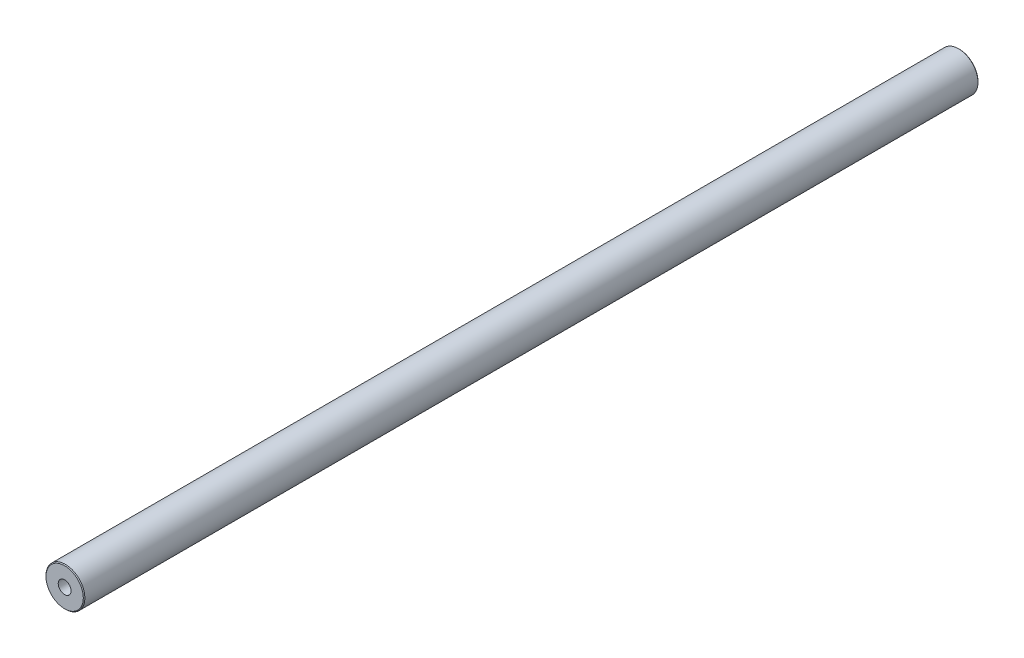
ISO-10303-21;
HEADER;
FILE_DESCRIPTION(('STEP AP214'),'2;1');
FILE_NAME('part.step','',(''),(''),'','','');
FILE_SCHEMA(('AUTOMOTIVE_DESIGN { 1 0 10303 214 1 1 1 1 }'));
ENDSEC;
DATA;
#1=APPLICATION_CONTEXT('core data for automotive mechanical design processes');
#2=APPLICATION_PROTOCOL_DEFINITION('international standard','automotive_design',2000,#1);
#3=PRODUCT_CONTEXT('',#1,'mechanical');
#4=PRODUCT('Part','Part','',(#3));
#5=PRODUCT_RELATED_PRODUCT_CATEGORY('part','',(#4));
#6=PRODUCT_DEFINITION_FORMATION('','',#4);
#7=PRODUCT_DEFINITION_CONTEXT('part definition',#1,'design');
#8=PRODUCT_DEFINITION('design','',#6,#7);
#9=PRODUCT_DEFINITION_SHAPE('','',#8);
#10=(LENGTH_UNIT() NAMED_UNIT(*) SI_UNIT(.MILLI.,.METRE.));
#11=(NAMED_UNIT(*) PLANE_ANGLE_UNIT() SI_UNIT($,.RADIAN.));
#12=(NAMED_UNIT(*) SI_UNIT($,.STERADIAN.) SOLID_ANGLE_UNIT());
#13=UNCERTAINTY_MEASURE_WITH_UNIT(LENGTH_MEASURE(1.E-05),#10,'distance_accuracy_value','');
#14=(GEOMETRIC_REPRESENTATION_CONTEXT(3) GLOBAL_UNCERTAINTY_ASSIGNED_CONTEXT((#13)) GLOBAL_UNIT_ASSIGNED_CONTEXT((#10,
#11,#12)) REPRESENTATION_CONTEXT('',''));
#15=CARTESIAN_POINT('',(0.,0.,0.));
#16=DIRECTION('',(0.,0.,1.));
#17=DIRECTION('',(1.,0.,0.));
#18=AXIS2_PLACEMENT_3D('',#15,#16,#17);
#19=CARTESIAN_POINT('',(0.,0.,115.));
#20=DIRECTION('',(0.,0.,-1.));
#21=DIRECTION('',(-1.,0.,0.));
#22=AXIS2_PLACEMENT_3D('',#19,#20,#21);
#23=CYLINDRICAL_SURFACE('',#22,5.);
#24=CARTESIAN_POINT('',(0.,0.,-114.8));
#25=DIRECTION('',(0.,0.,1.));
#26=DIRECTION('',(1.,0.,0.));
#27=AXIS2_PLACEMENT_3D('',#24,#25,#26);
#28=CIRCLE('',#27,5.);
#29=CARTESIAN_POINT('',(5.,0.,-114.8));
#30=VERTEX_POINT('',#29);
#31=EDGE_CURVE('E91',#30,#30,#28,.T.);
#32=ORIENTED_EDGE('',*,*,#31,.T.);
#33=EDGE_LOOP('',(#32));
#34=FACE_BOUND('',#33,.T.);
#35=CARTESIAN_POINT('',(0.,0.,114.8));
#36=DIRECTION('',(0.,0.,1.));
#37=DIRECTION('',(1.,0.,0.));
#38=AXIS2_PLACEMENT_3D('',#35,#36,#37);
#39=CIRCLE('',#38,5.);
#40=CARTESIAN_POINT('',(5.,0.,114.8));
#41=VERTEX_POINT('',#40);
#42=EDGE_CURVE('E87',#41,#41,#39,.F.);
#43=ORIENTED_EDGE('',*,*,#42,.T.);
#44=EDGE_LOOP('',(#43));
#45=FACE_BOUND('',#44,.T.);
#46=ADVANCED_FACE('F46',(#34,#45),#23,.T.);
#47=CARTESIAN_POINT('',(0.,0.,115.));
#48=DIRECTION('',(0.,0.,1.));
#49=DIRECTION('',(1.,0.,0.));
#50=AXIS2_PLACEMENT_3D('',#47,#48,#49);
#51=PLANE('',#50);
#52=CARTESIAN_POINT('',(0.,0.,115.));
#53=DIRECTION('',(0.,0.,1.));
#54=DIRECTION('',(1.,0.,0.));
#55=AXIS2_PLACEMENT_3D('',#52,#53,#54);
#56=CIRCLE('',#55,4.80000000000003);
#57=CARTESIAN_POINT('',(4.80000000000003,0.,115.));
#58=VERTEX_POINT('',#57);
#59=EDGE_CURVE('E11',#58,#58,#56,.T.);
#60=ORIENTED_EDGE('',*,*,#59,.T.);
#61=EDGE_LOOP('',(#60));
#62=FACE_BOUND('',#61,.T.);
#63=CARTESIAN_POINT('',(0.,0.,115.));
#64=DIRECTION('',(0.,0.,1.));
#65=DIRECTION('',(1.,0.,0.));
#66=AXIS2_PLACEMENT_3D('',#63,#64,#65);
#67=CIRCLE('',#66,1.65);
#68=CARTESIAN_POINT('',(1.65,0.,115.));
#69=VERTEX_POINT('',#68);
#70=EDGE_CURVE('E72',#69,#69,#67,.T.);
#71=ORIENTED_EDGE('',*,*,#70,.F.);
#72=EDGE_LOOP('',(#71));
#73=FACE_BOUND('',#72,.T.);
#74=ADVANCED_FACE('F109',(#62,#73),#51,.T.);
#75=CARTESIAN_POINT('',(0.,0.,-115.));
#76=DIRECTION('',(0.,0.,1.));
#77=DIRECTION('',(1.,0.,0.));
#78=AXIS2_PLACEMENT_3D('',#75,#76,#77);
#79=PLANE('',#78);
#80=CARTESIAN_POINT('',(0.,0.,-115.));
#81=DIRECTION('',(0.,0.,1.));
#82=DIRECTION('',(1.,0.,0.));
#83=AXIS2_PLACEMENT_3D('',#80,#81,#82);
#84=CIRCLE('',#83,4.80000000000003);
#85=CARTESIAN_POINT('',(4.80000000000003,0.,-115.));
#86=VERTEX_POINT('',#85);
#87=EDGE_CURVE('E55',#86,#86,#84,.F.);
#88=ORIENTED_EDGE('',*,*,#87,.T.);
#89=EDGE_LOOP('',(#88));
#90=FACE_BOUND('',#89,.T.);
#91=CARTESIAN_POINT('',(0.,0.,-115.));
#92=DIRECTION('',(0.,0.,-1.));
#93=DIRECTION('',(-1.,0.,0.));
#94=AXIS2_PLACEMENT_3D('',#91,#92,#93);
#95=CIRCLE('',#94,1.65);
#96=CARTESIAN_POINT('',(-1.65,0.,-115.));
#97=VERTEX_POINT('',#96);
#98=EDGE_CURVE('E73',#97,#97,#95,.T.);
#99=ORIENTED_EDGE('',*,*,#98,.F.);
#100=EDGE_LOOP('',(#99));
#101=FACE_BOUND('',#100,.T.);
#102=ADVANCED_FACE('F99',(#90,#101),#79,.F.);
#103=CARTESIAN_POINT('',(0.,0.,103.5));
#104=DIRECTION('',(0.,0.,1.));
#105=DIRECTION('',(1.,0.,0.));
#106=AXIS2_PLACEMENT_3D('',#103,#104,#105);
#107=CONICAL_SURFACE('',#106,1.65,1.02974425867665);
#108=CARTESIAN_POINT('',(0.,0.,102.508579978605));
#109=VERTEX_POINT('',#108);
#110=VERTEX_LOOP('',#109);
#111=FACE_BOUND('',#110,.T.);
#112=CARTESIAN_POINT('',(0.,0.,103.5));
#113=DIRECTION('',(0.,0.,1.));
#114=DIRECTION('',(1.,0.,0.));
#115=AXIS2_PLACEMENT_3D('',#112,#113,#114);
#116=CIRCLE('',#115,1.65);
#117=CARTESIAN_POINT('',(1.65,0.,103.5));
#118=VERTEX_POINT('',#117);
#119=EDGE_CURVE('E79',#118,#118,#116,.T.);
#120=ORIENTED_EDGE('',*,*,#119,.T.);
#121=EDGE_LOOP('',(#120));
#122=FACE_BOUND('',#121,.T.);
#123=ADVANCED_FACE('F123',(#111,#122),#107,.F.);
#124=CARTESIAN_POINT('',(0.,0.,115.));
#125=DIRECTION('',(0.,0.,1.));
#126=DIRECTION('',(1.,0.,0.));
#127=AXIS2_PLACEMENT_3D('',#124,#125,#126);
#128=CYLINDRICAL_SURFACE('',#127,1.65);
#129=ORIENTED_EDGE('',*,*,#119,.F.);
#130=EDGE_LOOP('',(#129));
#131=FACE_BOUND('',#130,.T.);
#132=ORIENTED_EDGE('',*,*,#70,.T.);
#133=EDGE_LOOP('',(#132));
#134=FACE_BOUND('',#133,.T.);
#135=ADVANCED_FACE('F65',(#131,#134),#128,.F.);
#136=CARTESIAN_POINT('',(0.,0.,-103.5));
#137=DIRECTION('',(0.,0.,-1.));
#138=DIRECTION('',(-1.,0.,0.));
#139=AXIS2_PLACEMENT_3D('',#136,#137,#138);
#140=CONICAL_SURFACE('',#139,1.65,1.02974425867665);
#141=CARTESIAN_POINT('',(0.,0.,-102.508579978605));
#142=VERTEX_POINT('',#141);
#143=VERTEX_LOOP('',#142);
#144=FACE_BOUND('',#143,.T.);
#145=CARTESIAN_POINT('',(0.,0.,-103.5));
#146=DIRECTION('',(0.,0.,-1.));
#147=DIRECTION('',(-1.,0.,0.));
#148=AXIS2_PLACEMENT_3D('',#145,#146,#147);
#149=CIRCLE('',#148,1.65);
#150=CARTESIAN_POINT('',(-1.65,0.,-103.5));
#151=VERTEX_POINT('',#150);
#152=EDGE_CURVE('E69',#151,#151,#149,.T.);
#153=ORIENTED_EDGE('',*,*,#152,.T.);
#154=EDGE_LOOP('',(#153));
#155=FACE_BOUND('',#154,.T.);
#156=ADVANCED_FACE('F61',(#144,#155),#140,.F.);
#157=CARTESIAN_POINT('',(0.,0.,-115.));
#158=DIRECTION('',(0.,0.,-1.));
#159=DIRECTION('',(-1.,0.,0.));
#160=AXIS2_PLACEMENT_3D('',#157,#158,#159);
#161=CYLINDRICAL_SURFACE('',#160,1.65);
#162=ORIENTED_EDGE('',*,*,#152,.F.);
#163=EDGE_LOOP('',(#162));
#164=FACE_BOUND('',#163,.T.);
#165=ORIENTED_EDGE('',*,*,#98,.T.);
#166=EDGE_LOOP('',(#165));
#167=FACE_BOUND('',#166,.T.);
#168=ADVANCED_FACE('F64',(#164,#167),#161,.F.);
#169=CARTESIAN_POINT('',(0.,0.,-114.8));
#170=DIRECTION('',(0.,0.,1.));
#171=DIRECTION('',(1.,0.,0.));
#172=AXIS2_PLACEMENT_3D('',#169,#170,#171);
#173=CONICAL_SURFACE('',#172,5.,0.785398163397368);
#174=ORIENTED_EDGE('',*,*,#87,.F.);
#175=EDGE_LOOP('',(#174));
#176=FACE_BOUND('',#175,.T.);
#177=ORIENTED_EDGE('',*,*,#31,.F.);
#178=EDGE_LOOP('',(#177));
#179=FACE_BOUND('',#178,.T.);
#180=ADVANCED_FACE('F102',(#176,#179),#173,.T.);
#181=CARTESIAN_POINT('',(0.,0.,115.));
#182=DIRECTION('',(0.,0.,-1.));
#183=DIRECTION('',(-1.,0.,0.));
#184=AXIS2_PLACEMENT_3D('',#181,#182,#183);
#185=CONICAL_SURFACE('',#184,4.80000000000003,0.785398163397368);
#186=ORIENTED_EDGE('',*,*,#42,.F.);
#187=EDGE_LOOP('',(#186));
#188=FACE_BOUND('',#187,.T.);
#189=ORIENTED_EDGE('',*,*,#59,.F.);
#190=EDGE_LOOP('',(#189));
#191=FACE_BOUND('',#190,.T.);
#192=ADVANCED_FACE('F48',(#188,#191),#185,.T.);
#193=CLOSED_SHELL('',(#46,#74,#102,#123,#135,#156,#168,#180,#192));
#194=MANIFOLD_SOLID_BREP('B2',#193);
#195=ADVANCED_BREP_SHAPE_REPRESENTATION('',(#18,#194),#14);
#196=SHAPE_DEFINITION_REPRESENTATION(#9,#195);
ENDSEC;
END-ISO-10303-21;
